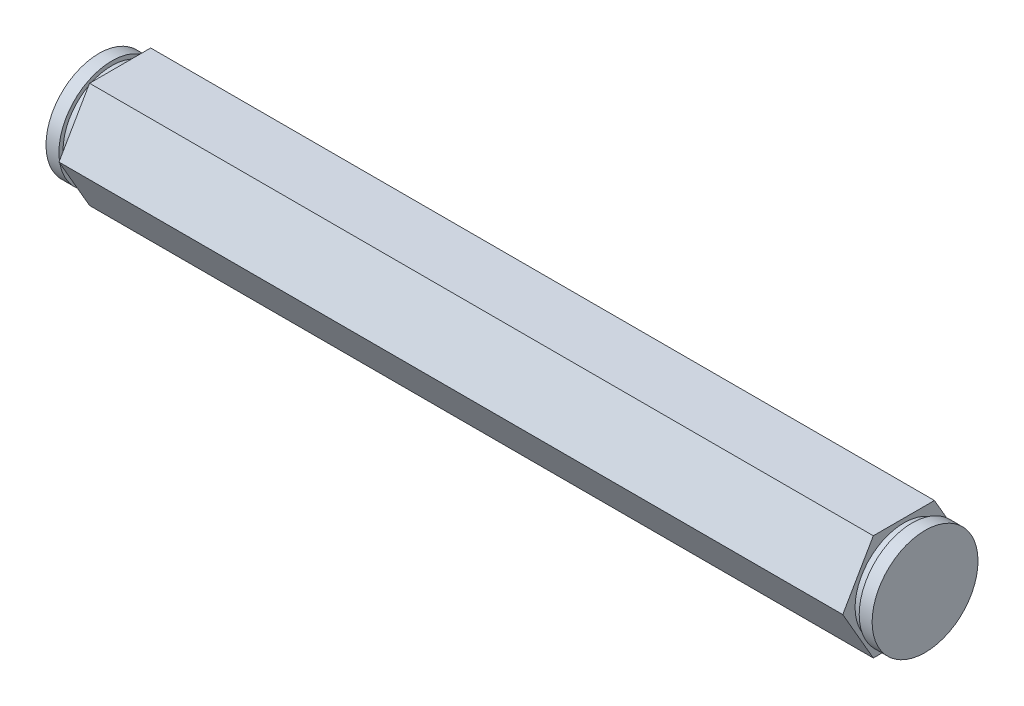
ISO-10303-21;
HEADER;
FILE_DESCRIPTION(('STEP AP214'),'2;1');
FILE_NAME('part.step','',(''),(''),'','','');
FILE_SCHEMA(('AUTOMOTIVE_DESIGN { 1 0 10303 214 1 1 1 1 }'));
ENDSEC;
DATA;
#1=APPLICATION_CONTEXT('core data for automotive mechanical design processes');
#2=APPLICATION_PROTOCOL_DEFINITION('international standard','automotive_design',2000,#1);
#3=PRODUCT_CONTEXT('',#1,'mechanical');
#4=PRODUCT('Part','Part','',(#3));
#5=PRODUCT_RELATED_PRODUCT_CATEGORY('part','',(#4));
#6=PRODUCT_DEFINITION_FORMATION('','',#4);
#7=PRODUCT_DEFINITION_CONTEXT('part definition',#1,'design');
#8=PRODUCT_DEFINITION('design','',#6,#7);
#9=PRODUCT_DEFINITION_SHAPE('','',#8);
#10=(LENGTH_UNIT() NAMED_UNIT(*) SI_UNIT(.MILLI.,.METRE.));
#11=(NAMED_UNIT(*) PLANE_ANGLE_UNIT() SI_UNIT($,.RADIAN.));
#12=(NAMED_UNIT(*) SI_UNIT($,.STERADIAN.) SOLID_ANGLE_UNIT());
#13=UNCERTAINTY_MEASURE_WITH_UNIT(LENGTH_MEASURE(1.E-05),#10,'distance_accuracy_value','');
#14=(GEOMETRIC_REPRESENTATION_CONTEXT(3) GLOBAL_UNCERTAINTY_ASSIGNED_CONTEXT((#13)) GLOBAL_UNIT_ASSIGNED_CONTEXT((#10,
#11,#12)) REPRESENTATION_CONTEXT('',''));
#15=CARTESIAN_POINT('',(0.,0.,0.));
#16=DIRECTION('',(0.,0.,1.));
#17=DIRECTION('',(1.,0.,0.));
#18=AXIS2_PLACEMENT_3D('',#15,#16,#17);
#19=CARTESIAN_POINT('',(49.544250035,-6.34999999999993,-3.66617420935418));
#20=DIRECTION('',(0.,0.499999999999995,0.866025403784441));
#21=DIRECTION('',(0.,-0.866025403784441,0.499999999999995));
#22=AXIS2_PLACEMENT_3D('',#19,#20,#21);
#23=PLANE('',#22);
#24=DIRECTION('',(-1.,0.,0.));
#25=VECTOR('',#24,1.);
#26=CARTESIAN_POINT('',(49.544250035,-6.34999999999993,-3.66617420935418));
#27=LINE('',#26,#25);
#28=CARTESIAN_POINT('',(47.004250035,-6.34999999999993,-3.66617420935418));
#29=VERTEX_POINT('',#28);
#30=CARTESIAN_POINT('',(-47.004250035,-6.34999999999993,-3.66617420935418));
#31=VERTEX_POINT('',#30);
#32=EDGE_CURVE('E113',#29,#31,#27,.T.);
#33=ORIENTED_EDGE('',*,*,#32,.T.);
#34=DIRECTION('',(0.,0.866025403784441,-0.499999999999995));
#35=VECTOR('',#34,1.);
#36=CARTESIAN_POINT('',(-47.004250035,-6.34999999999993,-3.66617420935418));
#37=LINE('',#36,#35);
#38=CARTESIAN_POINT('',(-47.004250035,0.,-7.33234841870821));
#39=VERTEX_POINT('',#38);
#40=EDGE_CURVE('E57',#31,#39,#37,.T.);
#41=ORIENTED_EDGE('',*,*,#40,.T.);
#42=DIRECTION('',(-1.,0.,0.));
#43=VECTOR('',#42,1.);
#44=CARTESIAN_POINT('',(49.544250035,0.,-7.33234841870821));
#45=LINE('',#44,#43);
#46=CARTESIAN_POINT('',(47.004250035,0.,-7.33234841870821));
#47=VERTEX_POINT('',#46);
#48=EDGE_CURVE('E130',#47,#39,#45,.T.);
#49=ORIENTED_EDGE('',*,*,#48,.F.);
#50=DIRECTION('',(0.,-0.866025403784441,0.499999999999995));
#51=VECTOR('',#50,1.);
#52=CARTESIAN_POINT('',(47.004250035,-6.34999999999993,-3.66617420935418));
#53=LINE('',#52,#51);
#54=EDGE_CURVE('E119',#47,#29,#53,.T.);
#55=ORIENTED_EDGE('',*,*,#54,.T.);
#56=EDGE_LOOP('',(#33,#41,#49,#55));
#57=FACE_BOUND('',#56,.T.);
#58=ADVANCED_FACE('F42',(#57),#23,.F.);
#59=CARTESIAN_POINT('',(49.544250035,0.,-7.33234841870821));
#60=DIRECTION('',(0.,-0.500000000000001,0.866025403784438));
#61=DIRECTION('',(0.,-0.866025403784438,-0.500000000000001));
#62=AXIS2_PLACEMENT_3D('',#59,#60,#61);
#63=PLANE('',#62);
#64=ORIENTED_EDGE('',*,*,#48,.T.);
#65=DIRECTION('',(0.,0.866025403784438,0.500000000000001));
#66=VECTOR('',#65,1.);
#67=CARTESIAN_POINT('',(-47.004250035,0.,-7.33234841870821));
#68=LINE('',#67,#66);
#69=CARTESIAN_POINT('',(-47.004250035,6.34999999999998,-3.66617420935409));
#70=VERTEX_POINT('',#69);
#71=EDGE_CURVE('E170',#39,#70,#68,.T.);
#72=ORIENTED_EDGE('',*,*,#71,.T.);
#73=DIRECTION('',(-1.,0.,0.));
#74=VECTOR('',#73,1.);
#75=CARTESIAN_POINT('',(49.544250035,6.34999999999998,-3.66617420935409));
#76=LINE('',#75,#74);
#77=CARTESIAN_POINT('',(47.004250035,6.34999999999998,-3.66617420935409));
#78=VERTEX_POINT('',#77);
#79=EDGE_CURVE('E126',#78,#70,#76,.T.);
#80=ORIENTED_EDGE('',*,*,#79,.F.);
#81=DIRECTION('',(0.,-0.866025403784438,-0.500000000000001));
#82=VECTOR('',#81,1.);
#83=CARTESIAN_POINT('',(47.004250035,0.,-7.33234841870821));
#84=LINE('',#83,#82);
#85=EDGE_CURVE('E198',#78,#47,#84,.T.);
#86=ORIENTED_EDGE('',*,*,#85,.T.);
#87=EDGE_LOOP('',(#64,#72,#80,#86));
#88=FACE_BOUND('',#87,.T.);
#89=ADVANCED_FACE('F208',(#88),#63,.F.);
#90=CARTESIAN_POINT('',(49.544250035,6.34999999999998,-3.66617420935409));
#91=DIRECTION('',(0.,-1.,0.));
#92=DIRECTION('',(0.,0.,-1.));
#93=AXIS2_PLACEMENT_3D('',#90,#91,#92);
#94=PLANE('',#93);
#95=ORIENTED_EDGE('',*,*,#79,.T.);
#96=DIRECTION('',(0.,0.,1.));
#97=VECTOR('',#96,1.);
#98=CARTESIAN_POINT('',(-47.004250035,6.34999999999998,-3.66617420935409));
#99=LINE('',#98,#97);
#100=CARTESIAN_POINT('',(-47.004250035,6.34999999999995,3.66617420935414));
#101=VERTEX_POINT('',#100);
#102=EDGE_CURVE('E166',#70,#101,#99,.T.);
#103=ORIENTED_EDGE('',*,*,#102,.T.);
#104=DIRECTION('',(-1.,0.,0.));
#105=VECTOR('',#104,1.);
#106=CARTESIAN_POINT('',(49.544250035,6.34999999999995,3.66617420935414));
#107=LINE('',#106,#105);
#108=CARTESIAN_POINT('',(47.004250035,6.34999999999995,3.66617420935414));
#109=VERTEX_POINT('',#108);
#110=EDGE_CURVE('E117',#109,#101,#107,.T.);
#111=ORIENTED_EDGE('',*,*,#110,.F.);
#112=DIRECTION('',(0.,0.,-1.));
#113=VECTOR('',#112,1.);
#114=CARTESIAN_POINT('',(47.004250035,6.34999999999998,-3.66617420935409));
#115=LINE('',#114,#113);
#116=EDGE_CURVE('E194',#109,#78,#115,.T.);
#117=ORIENTED_EDGE('',*,*,#116,.T.);
#118=EDGE_LOOP('',(#95,#103,#111,#117));
#119=FACE_BOUND('',#118,.T.);
#120=ADVANCED_FACE('F210',(#119),#94,.F.);
#121=CARTESIAN_POINT('',(49.544250035,6.34999999999995,3.66617420935414));
#122=DIRECTION('',(0.,-0.499999999999995,-0.866025403784442));
#123=DIRECTION('',(0.,0.866025403784442,-0.499999999999995));
#124=AXIS2_PLACEMENT_3D('',#121,#122,#123);
#125=PLANE('',#124);
#126=ORIENTED_EDGE('',*,*,#110,.T.);
#127=DIRECTION('',(0.,-0.866025403784442,0.499999999999995));
#128=VECTOR('',#127,1.);
#129=CARTESIAN_POINT('',(-47.004250035,6.34999999999995,3.66617420935414));
#130=LINE('',#129,#128);
#131=CARTESIAN_POINT('',(-47.004250035,0.,7.33234841870821));
#132=VERTEX_POINT('',#131);
#133=EDGE_CURVE('E107',#101,#132,#130,.T.);
#134=ORIENTED_EDGE('',*,*,#133,.T.);
#135=DIRECTION('',(-1.,0.,0.));
#136=VECTOR('',#135,1.);
#137=CARTESIAN_POINT('',(49.544250035,0.,7.33234841870821));
#138=LINE('',#137,#136);
#139=CARTESIAN_POINT('',(47.004250035,0.,7.33234841870821));
#140=VERTEX_POINT('',#139);
#141=EDGE_CURVE('E105',#140,#132,#138,.T.);
#142=ORIENTED_EDGE('',*,*,#141,.F.);
#143=DIRECTION('',(0.,0.866025403784442,-0.499999999999995));
#144=VECTOR('',#143,1.);
#145=CARTESIAN_POINT('',(47.004250035,6.34999999999995,3.66617420935414));
#146=LINE('',#145,#144);
#147=EDGE_CURVE('E190',#140,#109,#146,.T.);
#148=ORIENTED_EDGE('',*,*,#147,.T.);
#149=EDGE_LOOP('',(#126,#134,#142,#148));
#150=FACE_BOUND('',#149,.T.);
#151=ADVANCED_FACE('F213',(#150),#125,.F.);
#152=CARTESIAN_POINT('',(49.544250035,0.,7.33234841870821));
#153=DIRECTION('',(0.,0.500000000000007,-0.866025403784435));
#154=DIRECTION('',(0.,0.866025403784435,0.500000000000007));
#155=AXIS2_PLACEMENT_3D('',#152,#153,#154);
#156=PLANE('',#155);
#157=ORIENTED_EDGE('',*,*,#141,.T.);
#158=DIRECTION('',(0.,-0.866025403784435,-0.500000000000007));
#159=VECTOR('',#158,1.);
#160=CARTESIAN_POINT('',(-47.004250035,0.,7.33234841870821));
#161=LINE('',#160,#159);
#162=CARTESIAN_POINT('',(-47.004250035,-6.35,3.66617420935405));
#163=VERTEX_POINT('',#162);
#164=EDGE_CURVE('E93',#132,#163,#161,.T.);
#165=ORIENTED_EDGE('',*,*,#164,.T.);
#166=DIRECTION('',(-1.,0.,0.));
#167=VECTOR('',#166,1.);
#168=CARTESIAN_POINT('',(49.544250035,-6.35,3.66617420935405));
#169=LINE('',#168,#167);
#170=CARTESIAN_POINT('',(47.004250035,-6.35,3.66617420935405));
#171=VERTEX_POINT('',#170);
#172=EDGE_CURVE('E103',#171,#163,#169,.T.);
#173=ORIENTED_EDGE('',*,*,#172,.F.);
#174=DIRECTION('',(0.,0.866025403784435,0.500000000000007));
#175=VECTOR('',#174,1.);
#176=CARTESIAN_POINT('',(47.004250035,0.,7.33234841870821));
#177=LINE('',#176,#175);
#178=EDGE_CURVE('E64',#171,#140,#177,.T.);
#179=ORIENTED_EDGE('',*,*,#178,.T.);
#180=EDGE_LOOP('',(#157,#165,#173,#179));
#181=FACE_BOUND('',#180,.T.);
#182=ADVANCED_FACE('F102',(#181),#156,.F.);
#183=CARTESIAN_POINT('',(49.544250035,-6.35,3.66617420935405));
#184=DIRECTION('',(0.,1.,0.));
#185=DIRECTION('',(0.,0.,1.));
#186=AXIS2_PLACEMENT_3D('',#183,#184,#185);
#187=PLANE('',#186);
#188=ORIENTED_EDGE('',*,*,#172,.T.);
#189=DIRECTION('',(0.,0.,-1.));
#190=VECTOR('',#189,1.);
#191=CARTESIAN_POINT('',(-47.004250035,-6.35,3.66617420935405));
#192=LINE('',#191,#190);
#193=EDGE_CURVE('E11',#163,#31,#192,.T.);
#194=ORIENTED_EDGE('',*,*,#193,.T.);
#195=ORIENTED_EDGE('',*,*,#32,.F.);
#196=DIRECTION('',(0.,0.,1.));
#197=VECTOR('',#196,1.);
#198=CARTESIAN_POINT('',(47.004250035,-6.35,3.66617420935405));
#199=LINE('',#198,#197);
#200=EDGE_CURVE('E111',#29,#171,#199,.T.);
#201=ORIENTED_EDGE('',*,*,#200,.T.);
#202=EDGE_LOOP('',(#188,#194,#195,#201));
#203=FACE_BOUND('',#202,.T.);
#204=ADVANCED_FACE('F110',(#203),#187,.F.);
#205=CARTESIAN_POINT('',(47.004250035,0.,8.89));
#206=DIRECTION('',(-1.,0.,0.));
#207=DIRECTION('',(0.,0.,1.));
#208=AXIS2_PLACEMENT_3D('',#205,#206,#207);
#209=PLANE('',#208);
#210=CARTESIAN_POINT('',(47.004250035,0.,0.));
#211=DIRECTION('',(-1.,0.,0.));
#212=DIRECTION('',(0.,0.,1.));
#213=AXIS2_PLACEMENT_3D('',#210,#211,#212);
#214=CIRCLE('',#213,5.8547);
#215=CARTESIAN_POINT('',(47.004250035,0.,5.8547));
#216=VERTEX_POINT('',#215);
#217=EDGE_CURVE('E184',#216,#216,#214,.T.);
#218=ORIENTED_EDGE('',*,*,#217,.T.);
#219=EDGE_LOOP('',(#218));
#220=FACE_BOUND('',#219,.T.);
#221=ORIENTED_EDGE('',*,*,#85,.F.);
#222=ORIENTED_EDGE('',*,*,#116,.F.);
#223=ORIENTED_EDGE('',*,*,#147,.F.);
#224=ORIENTED_EDGE('',*,*,#178,.F.);
#225=ORIENTED_EDGE('',*,*,#200,.F.);
#226=ORIENTED_EDGE('',*,*,#54,.F.);
#227=EDGE_LOOP('',(#221,#222,#223,#224,#225,#226));
#228=FACE_BOUND('',#227,.T.);
#229=ADVANCED_FACE('F205',(#220,#228),#209,.F.);
#230=CARTESIAN_POINT('',(0.,0.,0.));
#231=DIRECTION('',(-1.,0.,0.));
#232=DIRECTION('',(0.,0.,1.));
#233=AXIS2_PLACEMENT_3D('',#230,#231,#232);
#234=CYLINDRICAL_SURFACE('',#233,6.35);
#235=CARTESIAN_POINT('',(49.544250035,0.,0.));
#236=DIRECTION('',(1.,0.,0.));
#237=DIRECTION('',(0.,0.,-1.));
#238=AXIS2_PLACEMENT_3D('',#235,#236,#237);
#239=CIRCLE('',#238,6.35);
#240=CARTESIAN_POINT('',(49.544250035,0.,-6.35));
#241=VERTEX_POINT('',#240);
#242=EDGE_CURVE('E134',#241,#241,#239,.F.);
#243=ORIENTED_EDGE('',*,*,#242,.T.);
#244=EDGE_LOOP('',(#243));
#245=FACE_BOUND('',#244,.T.);
#246=CARTESIAN_POINT('',(47.994850035,0.,0.));
#247=DIRECTION('',(-1.,0.,0.));
#248=DIRECTION('',(0.,0.,1.));
#249=AXIS2_PLACEMENT_3D('',#246,#247,#248);
#250=CIRCLE('',#249,6.35);
#251=CARTESIAN_POINT('',(47.994850035,0.,6.35));
#252=VERTEX_POINT('',#251);
#253=EDGE_CURVE('E176',#252,#252,#250,.T.);
#254=ORIENTED_EDGE('',*,*,#253,.F.);
#255=EDGE_LOOP('',(#254));
#256=FACE_BOUND('',#255,.T.);
#257=ADVANCED_FACE('F290',(#245,#256),#234,.T.);
#258=CARTESIAN_POINT('',(0.,0.,0.));
#259=DIRECTION('',(-1.,0.,0.));
#260=DIRECTION('',(0.,0.,1.));
#261=AXIS2_PLACEMENT_3D('',#258,#259,#260);
#262=CYLINDRICAL_SURFACE('',#261,5.8547);
#263=ORIENTED_EDGE('',*,*,#217,.F.);
#264=EDGE_LOOP('',(#263));
#265=FACE_BOUND('',#264,.T.);
#266=CARTESIAN_POINT('',(47.994850035,0.,0.));
#267=DIRECTION('',(-1.,0.,0.));
#268=DIRECTION('',(0.,0.,1.));
#269=AXIS2_PLACEMENT_3D('',#266,#267,#268);
#270=CIRCLE('',#269,5.8547);
#271=CARTESIAN_POINT('',(47.994850035,0.,5.8547));
#272=VERTEX_POINT('',#271);
#273=EDGE_CURVE('E180',#272,#272,#270,.T.);
#274=ORIENTED_EDGE('',*,*,#273,.T.);
#275=EDGE_LOOP('',(#274));
#276=FACE_BOUND('',#275,.T.);
#277=ADVANCED_FACE('F297',(#265,#276),#262,.T.);
#278=CARTESIAN_POINT('',(47.994850035,0.,5.8547));
#279=DIRECTION('',(1.,0.,0.));
#280=DIRECTION('',(0.,0.,-1.));
#281=AXIS2_PLACEMENT_3D('',#278,#279,#280);
#282=PLANE('',#281);
#283=ORIENTED_EDGE('',*,*,#273,.F.);
#284=EDGE_LOOP('',(#283));
#285=FACE_BOUND('',#284,.T.);
#286=ORIENTED_EDGE('',*,*,#253,.T.);
#287=EDGE_LOOP('',(#286));
#288=FACE_BOUND('',#287,.T.);
#289=ADVANCED_FACE('F265',(#285,#288),#282,.F.);
#290=CARTESIAN_POINT('',(49.544250035,0.,0.));
#291=DIRECTION('',(1.,0.,0.));
#292=DIRECTION('',(0.,0.,-1.));
#293=AXIS2_PLACEMENT_3D('',#290,#291,#292);
#294=PLANE('',#293);
#295=ORIENTED_EDGE('',*,*,#242,.F.);
#296=EDGE_LOOP('',(#295));
#297=FACE_BOUND('',#296,.T.);
#298=ADVANCED_FACE('F262',(#297),#294,.T.);
#299=CARTESIAN_POINT('',(-47.004250035,0.,8.89));
#300=DIRECTION('',(1.,0.,0.));
#301=DIRECTION('',(0.,0.,1.));
#302=AXIS2_PLACEMENT_3D('',#299,#300,#301);
#303=PLANE('',#302);
#304=CARTESIAN_POINT('',(-47.004250035,0.,0.));
#305=DIRECTION('',(-1.,0.,0.));
#306=DIRECTION('',(0.,0.,1.));
#307=AXIS2_PLACEMENT_3D('',#304,#305,#306);
#308=CIRCLE('',#307,5.8547);
#309=CARTESIAN_POINT('',(-47.004250035,0.,5.8547));
#310=VERTEX_POINT('',#309);
#311=EDGE_CURVE('E108',#310,#310,#308,.T.);
#312=ORIENTED_EDGE('',*,*,#311,.F.);
#313=EDGE_LOOP('',(#312));
#314=FACE_BOUND('',#313,.T.);
#315=ORIENTED_EDGE('',*,*,#193,.F.);
#316=ORIENTED_EDGE('',*,*,#164,.F.);
#317=ORIENTED_EDGE('',*,*,#133,.F.);
#318=ORIENTED_EDGE('',*,*,#102,.F.);
#319=ORIENTED_EDGE('',*,*,#71,.F.);
#320=ORIENTED_EDGE('',*,*,#40,.F.);
#321=EDGE_LOOP('',(#315,#316,#317,#318,#319,#320));
#322=FACE_BOUND('',#321,.T.);
#323=ADVANCED_FACE('F92',(#314,#322),#303,.F.);
#324=CARTESIAN_POINT('',(0.,0.,0.));
#325=DIRECTION('',(1.,0.,0.));
#326=DIRECTION('',(0.,0.,1.));
#327=AXIS2_PLACEMENT_3D('',#324,#325,#326);
#328=CYLINDRICAL_SURFACE('',#327,6.35);
#329=CARTESIAN_POINT('',(-49.544250035,0.,0.));
#330=DIRECTION('',(1.,0.,0.));
#331=DIRECTION('',(0.,0.,-1.));
#332=AXIS2_PLACEMENT_3D('',#329,#330,#331);
#333=CIRCLE('',#332,6.35);
#334=CARTESIAN_POINT('',(-49.544250035,0.,-6.35));
#335=VERTEX_POINT('',#334);
#336=EDGE_CURVE('E50',#335,#335,#333,.F.);
#337=ORIENTED_EDGE('',*,*,#336,.F.);
#338=EDGE_LOOP('',(#337));
#339=FACE_BOUND('',#338,.T.);
#340=CARTESIAN_POINT('',(-47.994850035,0.,0.));
#341=DIRECTION('',(-1.,0.,0.));
#342=DIRECTION('',(0.,0.,1.));
#343=AXIS2_PLACEMENT_3D('',#340,#341,#342);
#344=CIRCLE('',#343,6.35);
#345=CARTESIAN_POINT('',(-47.994850035,0.,6.35));
#346=VERTEX_POINT('',#345);
#347=EDGE_CURVE('E152',#346,#346,#344,.T.);
#348=ORIENTED_EDGE('',*,*,#347,.T.);
#349=EDGE_LOOP('',(#348));
#350=FACE_BOUND('',#349,.T.);
#351=ADVANCED_FACE('F145',(#339,#350),#328,.T.);
#352=CARTESIAN_POINT('',(0.,0.,0.));
#353=DIRECTION('',(1.,0.,0.));
#354=DIRECTION('',(0.,0.,1.));
#355=AXIS2_PLACEMENT_3D('',#352,#353,#354);
#356=CYLINDRICAL_SURFACE('',#355,5.8547);
#357=ORIENTED_EDGE('',*,*,#311,.T.);
#358=EDGE_LOOP('',(#357));
#359=FACE_BOUND('',#358,.T.);
#360=CARTESIAN_POINT('',(-47.994850035,0.,0.));
#361=DIRECTION('',(-1.,0.,0.));
#362=DIRECTION('',(0.,0.,1.));
#363=AXIS2_PLACEMENT_3D('',#360,#361,#362);
#364=CIRCLE('',#363,5.8547);
#365=CARTESIAN_POINT('',(-47.994850035,0.,5.8547));
#366=VERTEX_POINT('',#365);
#367=EDGE_CURVE('E155',#366,#366,#364,.T.);
#368=ORIENTED_EDGE('',*,*,#367,.F.);
#369=EDGE_LOOP('',(#368));
#370=FACE_BOUND('',#369,.T.);
#371=ADVANCED_FACE('F148',(#359,#370),#356,.T.);
#372=CARTESIAN_POINT('',(-47.994850035,0.,5.8547));
#373=DIRECTION('',(-1.,0.,0.));
#374=DIRECTION('',(0.,0.,-1.));
#375=AXIS2_PLACEMENT_3D('',#372,#373,#374);
#376=PLANE('',#375);
#377=ORIENTED_EDGE('',*,*,#367,.T.);
#378=EDGE_LOOP('',(#377));
#379=FACE_BOUND('',#378,.T.);
#380=ORIENTED_EDGE('',*,*,#347,.F.);
#381=EDGE_LOOP('',(#380));
#382=FACE_BOUND('',#381,.T.);
#383=ADVANCED_FACE('F278',(#379,#382),#376,.F.);
#384=CARTESIAN_POINT('',(-49.544250035,0.,0.));
#385=DIRECTION('',(1.,0.,0.));
#386=DIRECTION('',(0.,0.,-1.));
#387=AXIS2_PLACEMENT_3D('',#384,#385,#386);
#388=PLANE('',#387);
#389=ORIENTED_EDGE('',*,*,#336,.T.);
#390=EDGE_LOOP('',(#389));
#391=FACE_BOUND('',#390,.T.);
#392=ADVANCED_FACE('F143',(#391),#388,.F.);
#393=CLOSED_SHELL('',(#58,#89,#120,#151,#182,#204,#229,#257,#277,#289,#298,#323,#351,#371,#383,#392));
#394=MANIFOLD_SOLID_BREP('B2',#393);
#395=ADVANCED_BREP_SHAPE_REPRESENTATION('',(#18,#394),#14);
#396=SHAPE_DEFINITION_REPRESENTATION(#9,#395);
ENDSEC;
END-ISO-10303-21;
